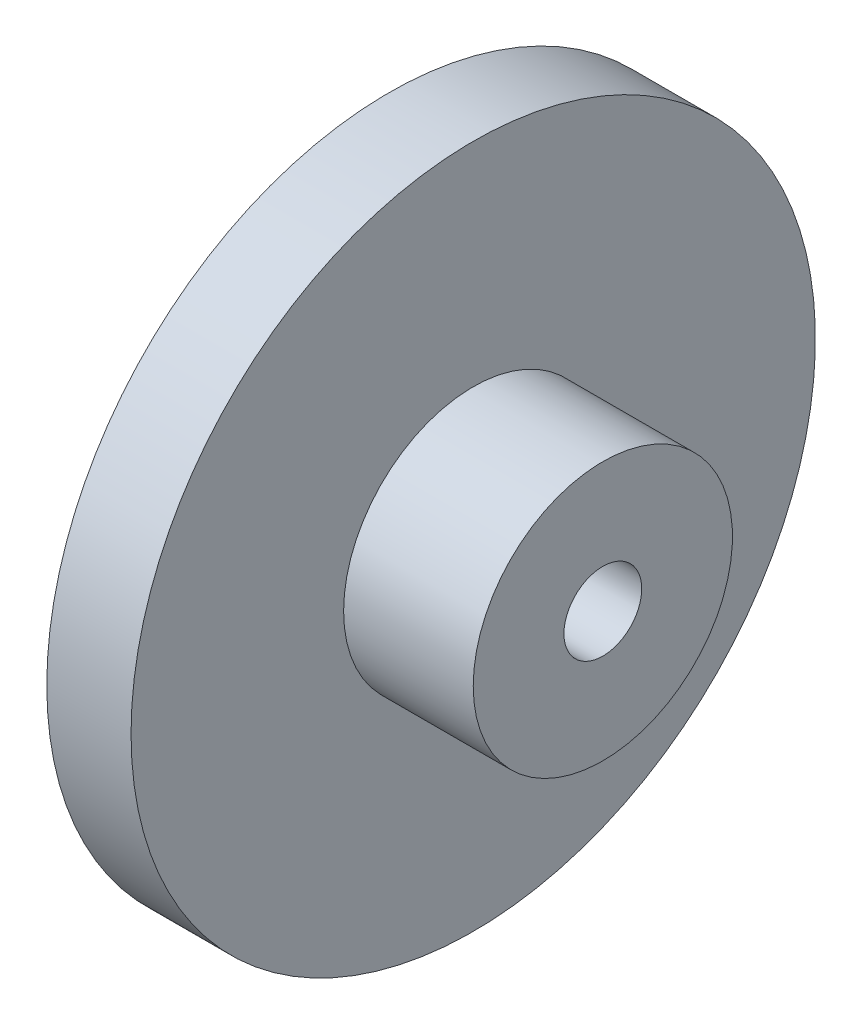
ISO-10303-21;
HEADER;
FILE_DESCRIPTION(('STEP AP214'),'2;1');
FILE_NAME('part.step','',(''),(''),'','','');
FILE_SCHEMA(('AUTOMOTIVE_DESIGN { 1 0 10303 214 1 1 1 1 }'));
ENDSEC;
DATA;
#1=APPLICATION_CONTEXT('core data for automotive mechanical design processes');
#2=APPLICATION_PROTOCOL_DEFINITION('international standard','automotive_design',2000,#1);
#3=PRODUCT_CONTEXT('',#1,'mechanical');
#4=PRODUCT('Part','Part','',(#3));
#5=PRODUCT_RELATED_PRODUCT_CATEGORY('part','',(#4));
#6=PRODUCT_DEFINITION_FORMATION('','',#4);
#7=PRODUCT_DEFINITION_CONTEXT('part definition',#1,'design');
#8=PRODUCT_DEFINITION('design','',#6,#7);
#9=PRODUCT_DEFINITION_SHAPE('','',#8);
#10=(LENGTH_UNIT() NAMED_UNIT(*) SI_UNIT(.MILLI.,.METRE.));
#11=(NAMED_UNIT(*) PLANE_ANGLE_UNIT() SI_UNIT($,.RADIAN.));
#12=(NAMED_UNIT(*) SI_UNIT($,.STERADIAN.) SOLID_ANGLE_UNIT());
#13=UNCERTAINTY_MEASURE_WITH_UNIT(LENGTH_MEASURE(1.E-05),#10,'distance_accuracy_value','');
#14=(GEOMETRIC_REPRESENTATION_CONTEXT(3) GLOBAL_UNCERTAINTY_ASSIGNED_CONTEXT((#13)) GLOBAL_UNIT_ASSIGNED_CONTEXT((#10,
#11,#12)) REPRESENTATION_CONTEXT('',''));
#15=CARTESIAN_POINT('',(0.,0.,0.));
#16=DIRECTION('',(0.,0.,1.));
#17=DIRECTION('',(1.,0.,0.));
#18=AXIS2_PLACEMENT_3D('',#15,#16,#17);
#19=CARTESIAN_POINT('',(-31.6088993149459,0.,0.));
#20=DIRECTION('',(-1.,0.,0.));
#21=DIRECTION('',(0.,0.,1.));
#22=AXIS2_PLACEMENT_3D('',#19,#20,#21);
#23=CYLINDRICAL_SURFACE('',#22,3.);
#24=CARTESIAN_POINT('',(16.5,0.,0.));
#25=DIRECTION('',(-1.,0.,0.));
#26=DIRECTION('',(0.,0.,1.));
#27=AXIS2_PLACEMENT_3D('',#24,#25,#26);
#28=CIRCLE('',#27,3.);
#29=CARTESIAN_POINT('',(16.5,0.,3.));
#30=VERTEX_POINT('',#29);
#31=EDGE_CURVE('E64',#30,#30,#28,.T.);
#32=ORIENTED_EDGE('',*,*,#31,.F.);
#33=EDGE_LOOP('',(#32));
#34=FACE_BOUND('',#33,.T.);
#35=CARTESIAN_POINT('',(0.,0.,0.));
#36=DIRECTION('',(-1.,0.,0.));
#37=DIRECTION('',(0.,0.,1.));
#38=AXIS2_PLACEMENT_3D('',#35,#36,#37);
#39=CIRCLE('',#38,3.);
#40=CARTESIAN_POINT('',(0.,0.,3.));
#41=VERTEX_POINT('',#40);
#42=EDGE_CURVE('E10',#41,#41,#39,.T.);
#43=ORIENTED_EDGE('',*,*,#42,.T.);
#44=EDGE_LOOP('',(#43));
#45=FACE_BOUND('',#44,.T.);
#46=ADVANCED_FACE('F37',(#34,#45),#23,.F.);
#47=CARTESIAN_POINT('',(0.,0.,-3.));
#48=DIRECTION('',(1.,0.,0.));
#49=DIRECTION('',(0.,0.,-1.));
#50=AXIS2_PLACEMENT_3D('',#47,#48,#49);
#51=PLANE('',#50);
#52=ORIENTED_EDGE('',*,*,#42,.F.);
#53=EDGE_LOOP('',(#52));
#54=FACE_BOUND('',#53,.T.);
#55=CARTESIAN_POINT('',(0.,0.,0.));
#56=DIRECTION('',(-1.,0.,0.));
#57=DIRECTION('',(0.,0.,1.));
#58=AXIS2_PLACEMENT_3D('',#55,#56,#57);
#59=CIRCLE('',#58,26.4);
#60=CARTESIAN_POINT('',(0.,0.,26.4));
#61=VERTEX_POINT('',#60);
#62=EDGE_CURVE('E44',#61,#61,#59,.T.);
#63=ORIENTED_EDGE('',*,*,#62,.T.);
#64=EDGE_LOOP('',(#63));
#65=FACE_BOUND('',#64,.T.);
#66=ADVANCED_FACE('F72',(#54,#65),#51,.F.);
#67=CARTESIAN_POINT('',(-31.6088993149459,0.,0.));
#68=DIRECTION('',(-1.,0.,0.));
#69=DIRECTION('',(0.,0.,1.));
#70=AXIS2_PLACEMENT_3D('',#67,#68,#69);
#71=CYLINDRICAL_SURFACE('',#70,26.4);
#72=ORIENTED_EDGE('',*,*,#62,.F.);
#73=EDGE_LOOP('',(#72));
#74=FACE_BOUND('',#73,.T.);
#75=CARTESIAN_POINT('',(6.5,0.,0.));
#76=DIRECTION('',(-1.,0.,0.));
#77=DIRECTION('',(0.,0.,1.));
#78=AXIS2_PLACEMENT_3D('',#75,#76,#77);
#79=CIRCLE('',#78,26.4);
#80=CARTESIAN_POINT('',(6.5,0.,26.4));
#81=VERTEX_POINT('',#80);
#82=EDGE_CURVE('E49',#81,#81,#79,.T.);
#83=ORIENTED_EDGE('',*,*,#82,.T.);
#84=EDGE_LOOP('',(#83));
#85=FACE_BOUND('',#84,.T.);
#86=ADVANCED_FACE('F76',(#74,#85),#71,.T.);
#87=CARTESIAN_POINT('',(6.5,0.,-26.4));
#88=DIRECTION('',(-1.,0.,0.));
#89=DIRECTION('',(0.,0.,1.));
#90=AXIS2_PLACEMENT_3D('',#87,#88,#89);
#91=PLANE('',#90);
#92=ORIENTED_EDGE('',*,*,#82,.F.);
#93=EDGE_LOOP('',(#92));
#94=FACE_BOUND('',#93,.T.);
#95=CARTESIAN_POINT('',(6.5,0.,0.));
#96=DIRECTION('',(-1.,0.,0.));
#97=DIRECTION('',(0.,0.,1.));
#98=AXIS2_PLACEMENT_3D('',#95,#96,#97);
#99=CIRCLE('',#98,10.);
#100=CARTESIAN_POINT('',(6.5,0.,10.));
#101=VERTEX_POINT('',#100);
#102=EDGE_CURVE('E54',#101,#101,#99,.T.);
#103=ORIENTED_EDGE('',*,*,#102,.T.);
#104=EDGE_LOOP('',(#103));
#105=FACE_BOUND('',#104,.T.);
#106=ADVANCED_FACE('F81',(#94,#105),#91,.F.);
#107=CARTESIAN_POINT('',(-31.6088993149459,0.,0.));
#108=DIRECTION('',(-1.,0.,0.));
#109=DIRECTION('',(0.,0.,1.));
#110=AXIS2_PLACEMENT_3D('',#107,#108,#109);
#111=CYLINDRICAL_SURFACE('',#110,10.);
#112=ORIENTED_EDGE('',*,*,#102,.F.);
#113=EDGE_LOOP('',(#112));
#114=FACE_BOUND('',#113,.T.);
#115=CARTESIAN_POINT('',(16.5,0.,0.));
#116=DIRECTION('',(-1.,0.,0.));
#117=DIRECTION('',(0.,0.,1.));
#118=AXIS2_PLACEMENT_3D('',#115,#116,#117);
#119=CIRCLE('',#118,10.);
#120=CARTESIAN_POINT('',(16.5,0.,10.));
#121=VERTEX_POINT('',#120);
#122=EDGE_CURVE('E60',#121,#121,#119,.T.);
#123=ORIENTED_EDGE('',*,*,#122,.T.);
#124=EDGE_LOOP('',(#123));
#125=FACE_BOUND('',#124,.T.);
#126=ADVANCED_FACE('F87',(#114,#125),#111,.T.);
#127=CARTESIAN_POINT('',(16.5,0.,-10.));
#128=DIRECTION('',(-1.,0.,0.));
#129=DIRECTION('',(0.,0.,1.));
#130=AXIS2_PLACEMENT_3D('',#127,#128,#129);
#131=PLANE('',#130);
#132=ORIENTED_EDGE('',*,*,#122,.F.);
#133=EDGE_LOOP('',(#132));
#134=FACE_BOUND('',#133,.T.);
#135=ORIENTED_EDGE('',*,*,#31,.T.);
#136=EDGE_LOOP('',(#135));
#137=FACE_BOUND('',#136,.T.);
#138=ADVANCED_FACE('F69',(#134,#137),#131,.F.);
#139=CLOSED_SHELL('',(#46,#66,#86,#106,#126,#138));
#140=MANIFOLD_SOLID_BREP('B2',#139);
#141=ADVANCED_BREP_SHAPE_REPRESENTATION('',(#18,#140),#14);
#142=SHAPE_DEFINITION_REPRESENTATION(#9,#141);
ENDSEC;
END-ISO-10303-21;
